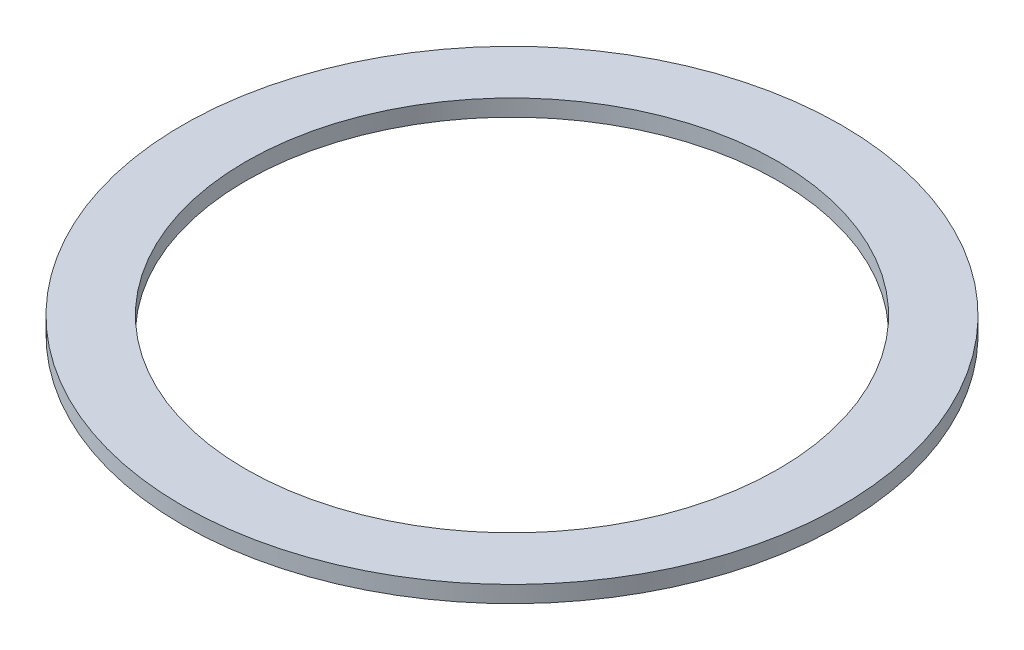
ISO-10303-21;
HEADER;
FILE_DESCRIPTION(('STEP AP214'),'2;1');
FILE_NAME('part.step','',(''),(''),'','','');
FILE_SCHEMA(('AUTOMOTIVE_DESIGN { 1 0 10303 214 1 1 1 1 }'));
ENDSEC;
DATA;
#1=APPLICATION_CONTEXT('core data for automotive mechanical design processes');
#2=APPLICATION_PROTOCOL_DEFINITION('international standard','automotive_design',2000,#1);
#3=PRODUCT_CONTEXT('',#1,'mechanical');
#4=PRODUCT('Part','Part','',(#3));
#5=PRODUCT_RELATED_PRODUCT_CATEGORY('part','',(#4));
#6=PRODUCT_DEFINITION_FORMATION('','',#4);
#7=PRODUCT_DEFINITION_CONTEXT('part definition',#1,'design');
#8=PRODUCT_DEFINITION('design','',#6,#7);
#9=PRODUCT_DEFINITION_SHAPE('','',#8);
#10=(LENGTH_UNIT() NAMED_UNIT(*) SI_UNIT(.MILLI.,.METRE.));
#11=(NAMED_UNIT(*) PLANE_ANGLE_UNIT() SI_UNIT($,.RADIAN.));
#12=(NAMED_UNIT(*) SI_UNIT($,.STERADIAN.) SOLID_ANGLE_UNIT());
#13=UNCERTAINTY_MEASURE_WITH_UNIT(LENGTH_MEASURE(1.E-05),#10,'distance_accuracy_value','');
#14=(GEOMETRIC_REPRESENTATION_CONTEXT(3) GLOBAL_UNCERTAINTY_ASSIGNED_CONTEXT((#13)) GLOBAL_UNIT_ASSIGNED_CONTEXT((#10,
#11,#12)) REPRESENTATION_CONTEXT('',''));
#15=CARTESIAN_POINT('',(0.,0.,0.));
#16=DIRECTION('',(0.,0.,1.));
#17=DIRECTION('',(1.,0.,0.));
#18=AXIS2_PLACEMENT_3D('',#15,#16,#17);
#19=CARTESIAN_POINT('',(0.,3.175,0.));
#20=DIRECTION('',(0.,1.,0.));
#21=DIRECTION('',(0.,0.,1.));
#22=AXIS2_PLACEMENT_3D('',#19,#20,#21);
#23=PLANE('',#22);
#24=CARTESIAN_POINT('',(0.,3.175,0.));
#25=DIRECTION('',(0.,1.,0.));
#26=DIRECTION('',(0.,0.,1.));
#27=AXIS2_PLACEMENT_3D('',#24,#25,#26);
#28=CIRCLE('',#27,62.865);
#29=CARTESIAN_POINT('',(0.,3.175,62.865));
#30=VERTEX_POINT('',#29);
#31=EDGE_CURVE('E10',#30,#30,#28,.T.);
#32=ORIENTED_EDGE('',*,*,#31,.T.);
#33=EDGE_LOOP('',(#32));
#34=FACE_BOUND('',#33,.T.);
#35=CARTESIAN_POINT('',(0.,3.175,0.));
#36=DIRECTION('',(0.,1.,0.));
#37=DIRECTION('',(0.,0.,1.));
#38=AXIS2_PLACEMENT_3D('',#35,#36,#37);
#39=CIRCLE('',#38,50.8);
#40=CARTESIAN_POINT('',(0.,3.175,50.8));
#41=VERTEX_POINT('',#40);
#42=EDGE_CURVE('E54',#41,#41,#39,.T.);
#43=ORIENTED_EDGE('',*,*,#42,.F.);
#44=EDGE_LOOP('',(#43));
#45=FACE_BOUND('',#44,.T.);
#46=ADVANCED_FACE('F41',(#34,#45),#23,.T.);
#47=CARTESIAN_POINT('',(0.,0.,0.));
#48=DIRECTION('',(0.,1.,0.));
#49=DIRECTION('',(0.,0.,1.));
#50=AXIS2_PLACEMENT_3D('',#47,#48,#49);
#51=PLANE('',#50);
#52=CARTESIAN_POINT('',(0.,0.,0.));
#53=DIRECTION('',(0.,1.,0.));
#54=DIRECTION('',(0.,0.,1.));
#55=AXIS2_PLACEMENT_3D('',#52,#53,#54);
#56=CIRCLE('',#55,62.865);
#57=CARTESIAN_POINT('',(0.,0.,62.865));
#58=VERTEX_POINT('',#57);
#59=EDGE_CURVE('E45',#58,#58,#56,.T.);
#60=ORIENTED_EDGE('',*,*,#59,.F.);
#61=EDGE_LOOP('',(#60));
#62=FACE_BOUND('',#61,.T.);
#63=CARTESIAN_POINT('',(0.,0.,0.));
#64=DIRECTION('',(0.,1.,0.));
#65=DIRECTION('',(0.,0.,1.));
#66=AXIS2_PLACEMENT_3D('',#63,#64,#65);
#67=CIRCLE('',#66,50.8);
#68=CARTESIAN_POINT('',(0.,0.,50.8));
#69=VERTEX_POINT('',#68);
#70=EDGE_CURVE('E56',#69,#69,#67,.T.);
#71=ORIENTED_EDGE('',*,*,#70,.T.);
#72=EDGE_LOOP('',(#71));
#73=FACE_BOUND('',#72,.T.);
#74=ADVANCED_FACE('F68',(#62,#73),#51,.F.);
#75=CARTESIAN_POINT('',(0.,3.175,0.));
#76=DIRECTION('',(0.,-1.,0.));
#77=DIRECTION('',(0.,0.,-1.));
#78=AXIS2_PLACEMENT_3D('',#75,#76,#77);
#79=CYLINDRICAL_SURFACE('',#78,62.865);
#80=ORIENTED_EDGE('',*,*,#31,.F.);
#81=EDGE_LOOP('',(#80));
#82=FACE_BOUND('',#81,.T.);
#83=ORIENTED_EDGE('',*,*,#59,.T.);
#84=EDGE_LOOP('',(#83));
#85=FACE_BOUND('',#84,.T.);
#86=ADVANCED_FACE('F43',(#82,#85),#79,.T.);
#87=CARTESIAN_POINT('',(0.,3.175,0.));
#88=DIRECTION('',(0.,-1.,0.));
#89=DIRECTION('',(0.,0.,-1.));
#90=AXIS2_PLACEMENT_3D('',#87,#88,#89);
#91=CYLINDRICAL_SURFACE('',#90,50.8);
#92=ORIENTED_EDGE('',*,*,#42,.T.);
#93=EDGE_LOOP('',(#92));
#94=FACE_BOUND('',#93,.T.);
#95=ORIENTED_EDGE('',*,*,#70,.F.);
#96=EDGE_LOOP('',(#95));
#97=FACE_BOUND('',#96,.T.);
#98=ADVANCED_FACE('F64',(#94,#97),#91,.F.);
#99=CLOSED_SHELL('',(#46,#74,#86,#98));
#100=MANIFOLD_SOLID_BREP('B2',#99);
#101=ADVANCED_BREP_SHAPE_REPRESENTATION('',(#18,#100),#14);
#102=SHAPE_DEFINITION_REPRESENTATION(#9,#101);
ENDSEC;
END-ISO-10303-21;
